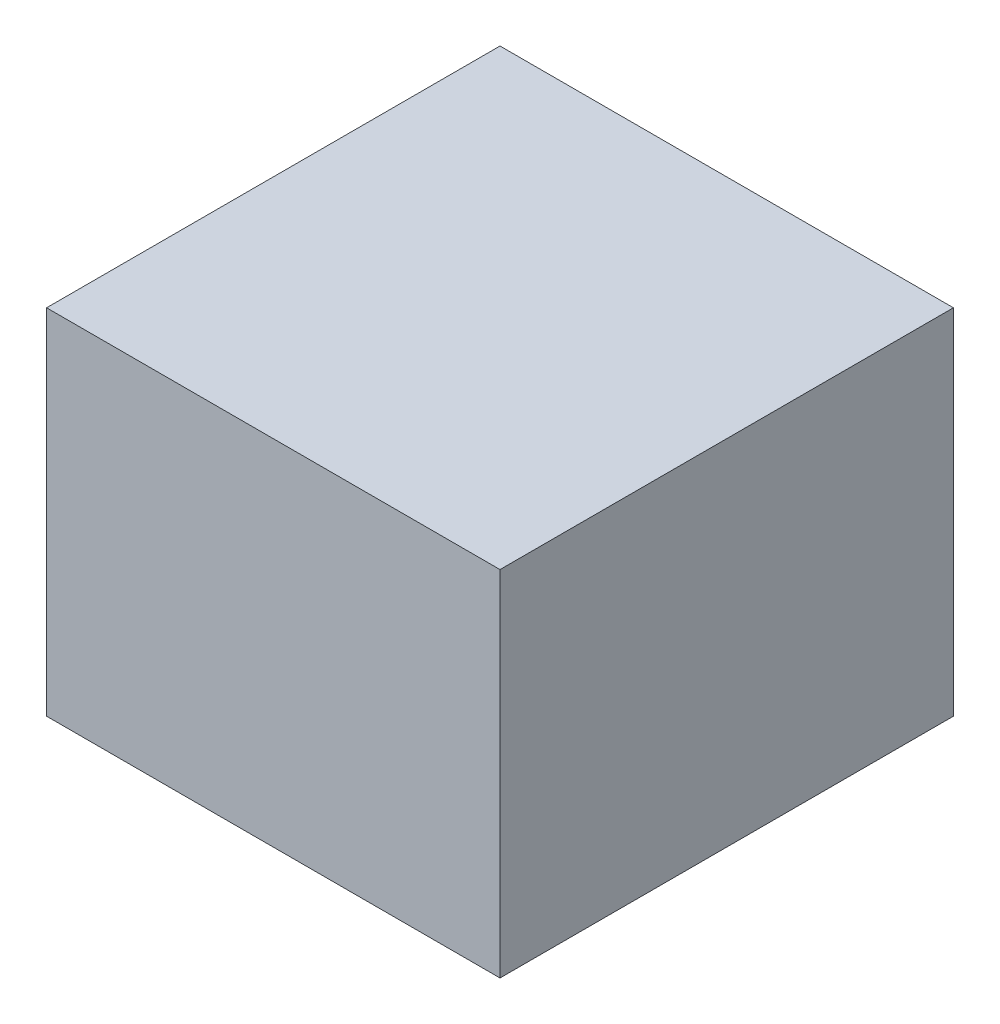
ISO-10303-21;
HEADER;
FILE_DESCRIPTION(('STEP AP214'),'2;1');
FILE_NAME('part.step','',(''),(''),'','','');
FILE_SCHEMA(('AUTOMOTIVE_DESIGN { 1 0 10303 214 1 1 1 1 }'));
ENDSEC;
DATA;
#1=APPLICATION_CONTEXT('core data for automotive mechanical design processes');
#2=APPLICATION_PROTOCOL_DEFINITION('international standard','automotive_design',2000,#1);
#3=PRODUCT_CONTEXT('',#1,'mechanical');
#4=PRODUCT('Part','Part','',(#3));
#5=PRODUCT_RELATED_PRODUCT_CATEGORY('part','',(#4));
#6=PRODUCT_DEFINITION_FORMATION('','',#4);
#7=PRODUCT_DEFINITION_CONTEXT('part definition',#1,'design');
#8=PRODUCT_DEFINITION('design','',#6,#7);
#9=PRODUCT_DEFINITION_SHAPE('','',#8);
#10=(LENGTH_UNIT() NAMED_UNIT(*) SI_UNIT(.MILLI.,.METRE.));
#11=(NAMED_UNIT(*) PLANE_ANGLE_UNIT() SI_UNIT($,.RADIAN.));
#12=(NAMED_UNIT(*) SI_UNIT($,.STERADIAN.) SOLID_ANGLE_UNIT());
#13=UNCERTAINTY_MEASURE_WITH_UNIT(LENGTH_MEASURE(1.E-05),#10,'distance_accuracy_value','');
#14=(GEOMETRIC_REPRESENTATION_CONTEXT(3) GLOBAL_UNCERTAINTY_ASSIGNED_CONTEXT((#13)) GLOBAL_UNIT_ASSIGNED_CONTEXT((#10,
#11,#12)) REPRESENTATION_CONTEXT('',''));
#15=CARTESIAN_POINT('',(0.,0.,0.));
#16=DIRECTION('',(0.,0.,1.));
#17=DIRECTION('',(1.,0.,0.));
#18=AXIS2_PLACEMENT_3D('',#15,#16,#17);
#19=CARTESIAN_POINT('',(0.,33.,-42.3));
#20=DIRECTION('',(0.,0.,-1.));
#21=DIRECTION('',(-1.,0.,0.));
#22=AXIS2_PLACEMENT_3D('',#19,#20,#21);
#23=PLANE('',#22);
#24=DIRECTION('',(1.,0.,0.));
#25=VECTOR('',#24,1.);
#26=CARTESIAN_POINT('',(0.,0.,-42.3));
#27=LINE('',#26,#25);
#28=CARTESIAN_POINT('',(0.,0.,-42.3));
#29=VERTEX_POINT('',#28);
#30=CARTESIAN_POINT('',(42.3,0.,-42.3));
#31=VERTEX_POINT('',#30);
#32=EDGE_CURVE('E141',#29,#31,#27,.T.);
#33=ORIENTED_EDGE('',*,*,#32,.F.);
#34=DIRECTION('',(0.,-1.,0.));
#35=VECTOR('',#34,1.);
#36=CARTESIAN_POINT('',(0.,33.,-42.3));
#37=LINE('',#36,#35);
#38=CARTESIAN_POINT('',(0.,33.,-42.3));
#39=VERTEX_POINT('',#38);
#40=EDGE_CURVE('E54',#39,#29,#37,.T.);
#41=ORIENTED_EDGE('',*,*,#40,.F.);
#42=DIRECTION('',(1.,0.,0.));
#43=VECTOR('',#42,1.);
#44=CARTESIAN_POINT('',(0.,33.,-42.3));
#45=LINE('',#44,#43);
#46=CARTESIAN_POINT('',(42.3,33.,-42.3));
#47=VERTEX_POINT('',#46);
#48=EDGE_CURVE('E142',#39,#47,#45,.T.);
#49=ORIENTED_EDGE('',*,*,#48,.T.);
#50=DIRECTION('',(0.,-1.,0.));
#51=VECTOR('',#50,1.);
#52=CARTESIAN_POINT('',(42.3,33.,-42.3));
#53=LINE('',#52,#51);
#54=EDGE_CURVE('E150',#47,#31,#53,.T.);
#55=ORIENTED_EDGE('',*,*,#54,.T.);
#56=EDGE_LOOP('',(#33,#41,#49,#55));
#57=FACE_BOUND('',#56,.T.);
#58=ADVANCED_FACE('F46',(#57),#23,.T.);
#59=CARTESIAN_POINT('',(0.,33.,0.));
#60=DIRECTION('',(-1.,0.,0.));
#61=DIRECTION('',(0.,0.,1.));
#62=AXIS2_PLACEMENT_3D('',#59,#60,#61);
#63=PLANE('',#62);
#64=DIRECTION('',(0.,0.,-1.));
#65=VECTOR('',#64,1.);
#66=CARTESIAN_POINT('',(0.,0.,0.));
#67=LINE('',#66,#65);
#68=CARTESIAN_POINT('',(0.,0.,0.));
#69=VERTEX_POINT('',#68);
#70=EDGE_CURVE('E144',#69,#29,#67,.T.);
#71=ORIENTED_EDGE('',*,*,#70,.F.);
#72=DIRECTION('',(0.,-1.,0.));
#73=VECTOR('',#72,1.);
#74=CARTESIAN_POINT('',(0.,33.,0.));
#75=LINE('',#74,#73);
#76=CARTESIAN_POINT('',(0.,33.,0.));
#77=VERTEX_POINT('',#76);
#78=EDGE_CURVE('E78',#77,#69,#75,.T.);
#79=ORIENTED_EDGE('',*,*,#78,.F.);
#80=DIRECTION('',(0.,0.,-1.));
#81=VECTOR('',#80,1.);
#82=CARTESIAN_POINT('',(0.,33.,0.));
#83=LINE('',#82,#81);
#84=EDGE_CURVE('E148',#77,#39,#83,.T.);
#85=ORIENTED_EDGE('',*,*,#84,.T.);
#86=ORIENTED_EDGE('',*,*,#40,.T.);
#87=EDGE_LOOP('',(#71,#79,#85,#86));
#88=FACE_BOUND('',#87,.T.);
#89=ADVANCED_FACE('F170',(#88),#63,.T.);
#90=CARTESIAN_POINT('',(0.,33.,0.));
#91=DIRECTION('',(0.,0.,-1.));
#92=DIRECTION('',(-1.,0.,0.));
#93=AXIS2_PLACEMENT_3D('',#90,#91,#92);
#94=PLANE('',#93);
#95=DIRECTION('',(1.,0.,0.));
#96=VECTOR('',#95,1.);
#97=CARTESIAN_POINT('',(0.,0.,0.));
#98=LINE('',#97,#96);
#99=CARTESIAN_POINT('',(42.3,0.,0.));
#100=VERTEX_POINT('',#99);
#101=EDGE_CURVE('E156',#69,#100,#98,.T.);
#102=ORIENTED_EDGE('',*,*,#101,.T.);
#103=DIRECTION('',(0.,-1.,0.));
#104=VECTOR('',#103,1.);
#105=CARTESIAN_POINT('',(42.3,33.,0.));
#106=LINE('',#105,#104);
#107=CARTESIAN_POINT('',(42.3,33.,0.));
#108=VERTEX_POINT('',#107);
#109=EDGE_CURVE('E162',#108,#100,#106,.T.);
#110=ORIENTED_EDGE('',*,*,#109,.F.);
#111=DIRECTION('',(1.,0.,0.));
#112=VECTOR('',#111,1.);
#113=CARTESIAN_POINT('',(0.,33.,0.));
#114=LINE('',#113,#112);
#115=EDGE_CURVE('E146',#77,#108,#114,.T.);
#116=ORIENTED_EDGE('',*,*,#115,.F.);
#117=ORIENTED_EDGE('',*,*,#78,.T.);
#118=EDGE_LOOP('',(#102,#110,#116,#117));
#119=FACE_BOUND('',#118,.T.);
#120=ADVANCED_FACE('F172',(#119),#94,.F.);
#121=CARTESIAN_POINT('',(42.3,33.,0.));
#122=DIRECTION('',(-1.,0.,0.));
#123=DIRECTION('',(0.,0.,1.));
#124=AXIS2_PLACEMENT_3D('',#121,#122,#123);
#125=PLANE('',#124);
#126=DIRECTION('',(0.,0.,-1.));
#127=VECTOR('',#126,1.);
#128=CARTESIAN_POINT('',(42.3,0.,0.));
#129=LINE('',#128,#127);
#130=EDGE_CURVE('E153',#100,#31,#129,.T.);
#131=ORIENTED_EDGE('',*,*,#130,.T.);
#132=ORIENTED_EDGE('',*,*,#54,.F.);
#133=DIRECTION('',(0.,0.,-1.));
#134=VECTOR('',#133,1.);
#135=CARTESIAN_POINT('',(42.3,33.,0.));
#136=LINE('',#135,#134);
#137=EDGE_CURVE('E89',#108,#47,#136,.T.);
#138=ORIENTED_EDGE('',*,*,#137,.F.);
#139=ORIENTED_EDGE('',*,*,#109,.T.);
#140=EDGE_LOOP('',(#131,#132,#138,#139));
#141=FACE_BOUND('',#140,.T.);
#142=ADVANCED_FACE('F166',(#141),#125,.F.);
#143=CARTESIAN_POINT('',(0.,33.,0.));
#144=DIRECTION('',(0.,1.,0.));
#145=DIRECTION('',(0.,0.,1.));
#146=AXIS2_PLACEMENT_3D('',#143,#144,#145);
#147=PLANE('',#146);
#148=ORIENTED_EDGE('',*,*,#48,.F.);
#149=ORIENTED_EDGE('',*,*,#84,.F.);
#150=ORIENTED_EDGE('',*,*,#115,.T.);
#151=ORIENTED_EDGE('',*,*,#137,.T.);
#152=EDGE_LOOP('',(#148,#149,#150,#151));
#153=FACE_BOUND('',#152,.T.);
#154=ADVANCED_FACE('F173',(#153),#147,.T.);
#155=CARTESIAN_POINT('',(0.,0.,0.));
#156=DIRECTION('',(0.,1.,0.));
#157=DIRECTION('',(0.,0.,1.));
#158=AXIS2_PLACEMENT_3D('',#155,#156,#157);
#159=PLANE('',#158);
#160=CARTESIAN_POINT('',(21.15,0.,-21.15));
#161=DIRECTION('',(0.,1.,0.));
#162=DIRECTION('',(0.,0.,1.));
#163=AXIS2_PLACEMENT_3D('',#160,#161,#162);
#164=CIRCLE('',#163,11.);
#165=CARTESIAN_POINT('',(21.15,0.,-10.15));
#166=VERTEX_POINT('',#165);
#167=EDGE_CURVE('E330',#166,#166,#164,.T.);
#168=ORIENTED_EDGE('',*,*,#167,.T.);
#169=EDGE_LOOP('',(#168));
#170=FACE_BOUND('',#169,.T.);
#171=CARTESIAN_POINT('',(5.65000000000001,0.,-36.65));
#172=DIRECTION('',(0.,-1.,0.));
#173=DIRECTION('',(0.,0.,-1.));
#174=AXIS2_PLACEMENT_3D('',#171,#172,#173);
#175=CIRCLE('',#174,2.10999999999999);
#176=CARTESIAN_POINT('',(5.65000000000001,0.,-38.76));
#177=VERTEX_POINT('',#176);
#178=EDGE_CURVE('E114',#177,#177,#175,.T.);
#179=ORIENTED_EDGE('',*,*,#178,.F.);
#180=EDGE_LOOP('',(#179));
#181=FACE_BOUND('',#180,.T.);
#182=CARTESIAN_POINT('',(5.65000000000001,0.,-5.64999999999999));
#183=DIRECTION('',(0.,-1.,0.));
#184=DIRECTION('',(0.,0.,-1.));
#185=AXIS2_PLACEMENT_3D('',#182,#183,#184);
#186=CIRCLE('',#185,2.10999999999999);
#187=CARTESIAN_POINT('',(5.65000000000001,0.,-7.75999999999998));
#188=VERTEX_POINT('',#187);
#189=EDGE_CURVE('E113',#188,#188,#186,.T.);
#190=ORIENTED_EDGE('',*,*,#189,.F.);
#191=EDGE_LOOP('',(#190));
#192=FACE_BOUND('',#191,.T.);
#193=CARTESIAN_POINT('',(36.65,0.,-5.65));
#194=DIRECTION('',(0.,-1.,0.));
#195=DIRECTION('',(0.,0.,-1.));
#196=AXIS2_PLACEMENT_3D('',#193,#194,#195);
#197=CIRCLE('',#196,2.10999999999999);
#198=CARTESIAN_POINT('',(36.65,0.,-7.75999999999998));
#199=VERTEX_POINT('',#198);
#200=EDGE_CURVE('E126',#199,#199,#197,.T.);
#201=ORIENTED_EDGE('',*,*,#200,.F.);
#202=EDGE_LOOP('',(#201));
#203=FACE_BOUND('',#202,.T.);
#204=CARTESIAN_POINT('',(36.65,0.,-36.65));
#205=DIRECTION('',(0.,-1.,0.));
#206=DIRECTION('',(0.,0.,-1.));
#207=AXIS2_PLACEMENT_3D('',#204,#205,#206);
#208=CIRCLE('',#207,2.10999999999999);
#209=CARTESIAN_POINT('',(36.65,0.,-38.76));
#210=VERTEX_POINT('',#209);
#211=EDGE_CURVE('E132',#210,#210,#208,.T.);
#212=ORIENTED_EDGE('',*,*,#211,.F.);
#213=EDGE_LOOP('',(#212));
#214=FACE_BOUND('',#213,.T.);
#215=ORIENTED_EDGE('',*,*,#32,.T.);
#216=ORIENTED_EDGE('',*,*,#130,.F.);
#217=ORIENTED_EDGE('',*,*,#101,.F.);
#218=ORIENTED_EDGE('',*,*,#70,.T.);
#219=EDGE_LOOP('',(#215,#216,#217,#218));
#220=FACE_BOUND('',#219,.T.);
#221=ADVANCED_FACE('F169',(#170,#181,#192,#203,#214,#220),#159,.F.);
#222=CARTESIAN_POINT('',(36.65,4.5,-36.65));
#223=DIRECTION('',(0.,-1.,0.));
#224=DIRECTION('',(0.,0.,-1.));
#225=AXIS2_PLACEMENT_3D('',#222,#223,#224);
#226=CONICAL_SURFACE('',#225,2.11,1.02974425867665);
#227=CARTESIAN_POINT('',(36.65,5.76781590614815,-36.65));
#228=VERTEX_POINT('',#227);
#229=VERTEX_LOOP('',#228);
#230=FACE_BOUND('',#229,.T.);
#231=CARTESIAN_POINT('',(36.65,4.5,-36.65));
#232=DIRECTION('',(0.,-1.,0.));
#233=DIRECTION('',(0.,0.,-1.));
#234=AXIS2_PLACEMENT_3D('',#231,#232,#233);
#235=CIRCLE('',#234,2.11);
#236=CARTESIAN_POINT('',(36.65,4.5,-38.76));
#237=VERTEX_POINT('',#236);
#238=EDGE_CURVE('E135',#237,#237,#235,.T.);
#239=ORIENTED_EDGE('',*,*,#238,.T.);
#240=EDGE_LOOP('',(#239));
#241=FACE_BOUND('',#240,.T.);
#242=ADVANCED_FACE('F180',(#230,#241),#226,.F.);
#243=CARTESIAN_POINT('',(36.65,0.,-36.65));
#244=DIRECTION('',(0.,-1.,0.));
#245=DIRECTION('',(0.,0.,-1.));
#246=AXIS2_PLACEMENT_3D('',#243,#244,#245);
#247=CYLINDRICAL_SURFACE('',#246,2.10999999999999);
#248=ORIENTED_EDGE('',*,*,#238,.F.);
#249=EDGE_LOOP('',(#248));
#250=FACE_BOUND('',#249,.T.);
#251=ORIENTED_EDGE('',*,*,#211,.T.);
#252=EDGE_LOOP('',(#251));
#253=FACE_BOUND('',#252,.T.);
#254=ADVANCED_FACE('F227',(#250,#253),#247,.F.);
#255=CARTESIAN_POINT('',(36.65,4.5,-5.65));
#256=DIRECTION('',(0.,-1.,0.));
#257=DIRECTION('',(0.,0.,-1.));
#258=AXIS2_PLACEMENT_3D('',#255,#256,#257);
#259=CONICAL_SURFACE('',#258,2.11,1.02974425867665);
#260=CARTESIAN_POINT('',(36.65,5.76781590614815,-5.65));
#261=VERTEX_POINT('',#260);
#262=VERTEX_LOOP('',#261);
#263=FACE_BOUND('',#262,.T.);
#264=CARTESIAN_POINT('',(36.65,4.5,-5.65));
#265=DIRECTION('',(0.,-1.,0.));
#266=DIRECTION('',(0.,0.,-1.));
#267=AXIS2_PLACEMENT_3D('',#264,#265,#266);
#268=CIRCLE('',#267,2.11);
#269=CARTESIAN_POINT('',(36.65,4.5,-7.76));
#270=VERTEX_POINT('',#269);
#271=EDGE_CURVE('E129',#270,#270,#268,.T.);
#272=ORIENTED_EDGE('',*,*,#271,.T.);
#273=EDGE_LOOP('',(#272));
#274=FACE_BOUND('',#273,.T.);
#275=ADVANCED_FACE('F237',(#263,#274),#259,.F.);
#276=CARTESIAN_POINT('',(36.65,0.,-5.65));
#277=DIRECTION('',(0.,-1.,0.));
#278=DIRECTION('',(0.,0.,-1.));
#279=AXIS2_PLACEMENT_3D('',#276,#277,#278);
#280=CYLINDRICAL_SURFACE('',#279,2.10999999999999);
#281=ORIENTED_EDGE('',*,*,#271,.F.);
#282=EDGE_LOOP('',(#281));
#283=FACE_BOUND('',#282,.T.);
#284=ORIENTED_EDGE('',*,*,#200,.T.);
#285=EDGE_LOOP('',(#284));
#286=FACE_BOUND('',#285,.T.);
#287=ADVANCED_FACE('F247',(#283,#286),#280,.F.);
#288=CARTESIAN_POINT('',(5.65000000000001,4.5,-5.64999999999999));
#289=DIRECTION('',(0.,-1.,0.));
#290=DIRECTION('',(0.,0.,-1.));
#291=AXIS2_PLACEMENT_3D('',#288,#289,#290);
#292=CONICAL_SURFACE('',#291,2.11,1.02974425867665);
#293=CARTESIAN_POINT('',(5.65000000000001,5.76781590614815,-5.64999999999999));
#294=VERTEX_POINT('',#293);
#295=VERTEX_LOOP('',#294);
#296=FACE_BOUND('',#295,.T.);
#297=CARTESIAN_POINT('',(5.65000000000001,4.5,-5.64999999999999));
#298=DIRECTION('',(0.,-1.,0.));
#299=DIRECTION('',(0.,0.,-1.));
#300=AXIS2_PLACEMENT_3D('',#297,#298,#299);
#301=CIRCLE('',#300,2.11);
#302=CARTESIAN_POINT('',(5.65000000000001,4.5,-7.75999999999999));
#303=VERTEX_POINT('',#302);
#304=EDGE_CURVE('E117',#303,#303,#301,.T.);
#305=ORIENTED_EDGE('',*,*,#304,.T.);
#306=EDGE_LOOP('',(#305));
#307=FACE_BOUND('',#306,.T.);
#308=ADVANCED_FACE('F257',(#296,#307),#292,.F.);
#309=CARTESIAN_POINT('',(5.65000000000001,0.,-5.64999999999999));
#310=DIRECTION('',(0.,-1.,0.));
#311=DIRECTION('',(0.,0.,-1.));
#312=AXIS2_PLACEMENT_3D('',#309,#310,#311);
#313=CYLINDRICAL_SURFACE('',#312,2.10999999999999);
#314=ORIENTED_EDGE('',*,*,#304,.F.);
#315=EDGE_LOOP('',(#314));
#316=FACE_BOUND('',#315,.T.);
#317=ORIENTED_EDGE('',*,*,#189,.T.);
#318=EDGE_LOOP('',(#317));
#319=FACE_BOUND('',#318,.T.);
#320=ADVANCED_FACE('F107',(#316,#319),#313,.F.);
#321=CARTESIAN_POINT('',(5.65000000000001,4.5,-36.65));
#322=DIRECTION('',(0.,-1.,0.));
#323=DIRECTION('',(0.,0.,-1.));
#324=AXIS2_PLACEMENT_3D('',#321,#322,#323);
#325=CONICAL_SURFACE('',#324,2.11,1.02974425867665);
#326=CARTESIAN_POINT('',(5.65,5.76781590614815,-36.65));
#327=VERTEX_POINT('',#326);
#328=VERTEX_LOOP('',#327);
#329=FACE_BOUND('',#328,.T.);
#330=CARTESIAN_POINT('',(5.65000000000001,4.5,-36.65));
#331=DIRECTION('',(0.,-1.,0.));
#332=DIRECTION('',(0.,0.,-1.));
#333=AXIS2_PLACEMENT_3D('',#330,#331,#332);
#334=CIRCLE('',#333,2.11);
#335=CARTESIAN_POINT('',(5.65000000000001,4.5,-38.76));
#336=VERTEX_POINT('',#335);
#337=EDGE_CURVE('E111',#336,#336,#334,.T.);
#338=ORIENTED_EDGE('',*,*,#337,.T.);
#339=EDGE_LOOP('',(#338));
#340=FACE_BOUND('',#339,.T.);
#341=ADVANCED_FACE('F103',(#329,#340),#325,.F.);
#342=CARTESIAN_POINT('',(5.65000000000001,0.,-36.65));
#343=DIRECTION('',(0.,-1.,0.));
#344=DIRECTION('',(0.,0.,-1.));
#345=AXIS2_PLACEMENT_3D('',#342,#343,#344);
#346=CYLINDRICAL_SURFACE('',#345,2.10999999999999);
#347=ORIENTED_EDGE('',*,*,#337,.F.);
#348=EDGE_LOOP('',(#347));
#349=FACE_BOUND('',#348,.T.);
#350=ORIENTED_EDGE('',*,*,#178,.T.);
#351=EDGE_LOOP('',(#350));
#352=FACE_BOUND('',#351,.T.);
#353=ADVANCED_FACE('F106',(#349,#352),#346,.F.);
#354=CARTESIAN_POINT('',(21.15,-2.,-21.15));
#355=DIRECTION('',(0.,1.,0.));
#356=DIRECTION('',(0.,0.,1.));
#357=AXIS2_PLACEMENT_3D('',#354,#355,#356);
#358=CYLINDRICAL_SURFACE('',#357,11.);
#359=CARTESIAN_POINT('',(21.15,-2.,-21.15));
#360=DIRECTION('',(0.,1.,0.));
#361=DIRECTION('',(0.,0.,1.));
#362=AXIS2_PLACEMENT_3D('',#359,#360,#361);
#363=CIRCLE('',#362,11.);
#364=CARTESIAN_POINT('',(21.15,-2.,-10.15));
#365=VERTEX_POINT('',#364);
#366=EDGE_CURVE('E120',#365,#365,#363,.T.);
#367=ORIENTED_EDGE('',*,*,#366,.T.);
#368=EDGE_LOOP('',(#367));
#369=FACE_BOUND('',#368,.T.);
#370=ORIENTED_EDGE('',*,*,#167,.F.);
#371=EDGE_LOOP('',(#370));
#372=FACE_BOUND('',#371,.T.);
#373=ADVANCED_FACE('F291',(#369,#372),#358,.T.);
#374=CARTESIAN_POINT('',(21.15,-2.,-21.15));
#375=DIRECTION('',(0.,1.,0.));
#376=DIRECTION('',(0.,0.,1.));
#377=AXIS2_PLACEMENT_3D('',#374,#375,#376);
#378=PLANE('',#377);
#379=CARTESIAN_POINT('',(21.15,-2.,-21.15));
#380=DIRECTION('',(0.,1.,0.));
#381=DIRECTION('',(0.,0.,1.));
#382=AXIS2_PLACEMENT_3D('',#379,#380,#381);
#383=CIRCLE('',#382,2.5);
#384=CARTESIAN_POINT('',(21.15,-2.,-18.65));
#385=VERTEX_POINT('',#384);
#386=EDGE_CURVE('E13',#385,#385,#383,.T.);
#387=ORIENTED_EDGE('',*,*,#386,.T.);
#388=EDGE_LOOP('',(#387));
#389=FACE_BOUND('',#388,.T.);
#390=ORIENTED_EDGE('',*,*,#366,.F.);
#391=EDGE_LOOP('',(#390));
#392=FACE_BOUND('',#391,.T.);
#393=ADVANCED_FACE('F215',(#389,#392),#378,.F.);
#394=CARTESIAN_POINT('',(21.15,-18.,-21.15));
#395=DIRECTION('',(0.,-1.,0.));
#396=DIRECTION('',(0.,0.,-1.));
#397=AXIS2_PLACEMENT_3D('',#394,#395,#396);
#398=PLANE('',#397);
#399=CARTESIAN_POINT('',(21.15,-18.,-21.15));
#400=DIRECTION('',(0.,-1.,0.));
#401=DIRECTION('',(0.,0.,-1.));
#402=AXIS2_PLACEMENT_3D('',#399,#400,#401);
#403=CIRCLE('',#402,2.5);
#404=CARTESIAN_POINT('',(21.15,-18.,-23.65));
#405=VERTEX_POINT('',#404);
#406=EDGE_CURVE('E138',#405,#405,#403,.T.);
#407=ORIENTED_EDGE('',*,*,#406,.T.);
#408=EDGE_LOOP('',(#407));
#409=FACE_BOUND('',#408,.T.);
#410=ADVANCED_FACE('F209',(#409),#398,.T.);
#411=CARTESIAN_POINT('',(21.15,-18.,-21.15));
#412=DIRECTION('',(0.,1.,0.));
#413=DIRECTION('',(0.,0.,1.));
#414=AXIS2_PLACEMENT_3D('',#411,#412,#413);
#415=CYLINDRICAL_SURFACE('',#414,2.5);
#416=ORIENTED_EDGE('',*,*,#406,.F.);
#417=EDGE_LOOP('',(#416));
#418=FACE_BOUND('',#417,.T.);
#419=ORIENTED_EDGE('',*,*,#386,.F.);
#420=EDGE_LOOP('',(#419));
#421=FACE_BOUND('',#420,.T.);
#422=ADVANCED_FACE('F214',(#418,#421),#415,.T.);
#423=CLOSED_SHELL('',(#58,#89,#120,#142,#154,#221,#242,#254,#275,#287,#308,#320,#341,#353,#373,
#393,#410,#422));
#424=MANIFOLD_SOLID_BREP('B2',#423);
#425=ADVANCED_BREP_SHAPE_REPRESENTATION('',(#18,#424),#14);
#426=SHAPE_DEFINITION_REPRESENTATION(#9,#425);
ENDSEC;
END-ISO-10303-21;
